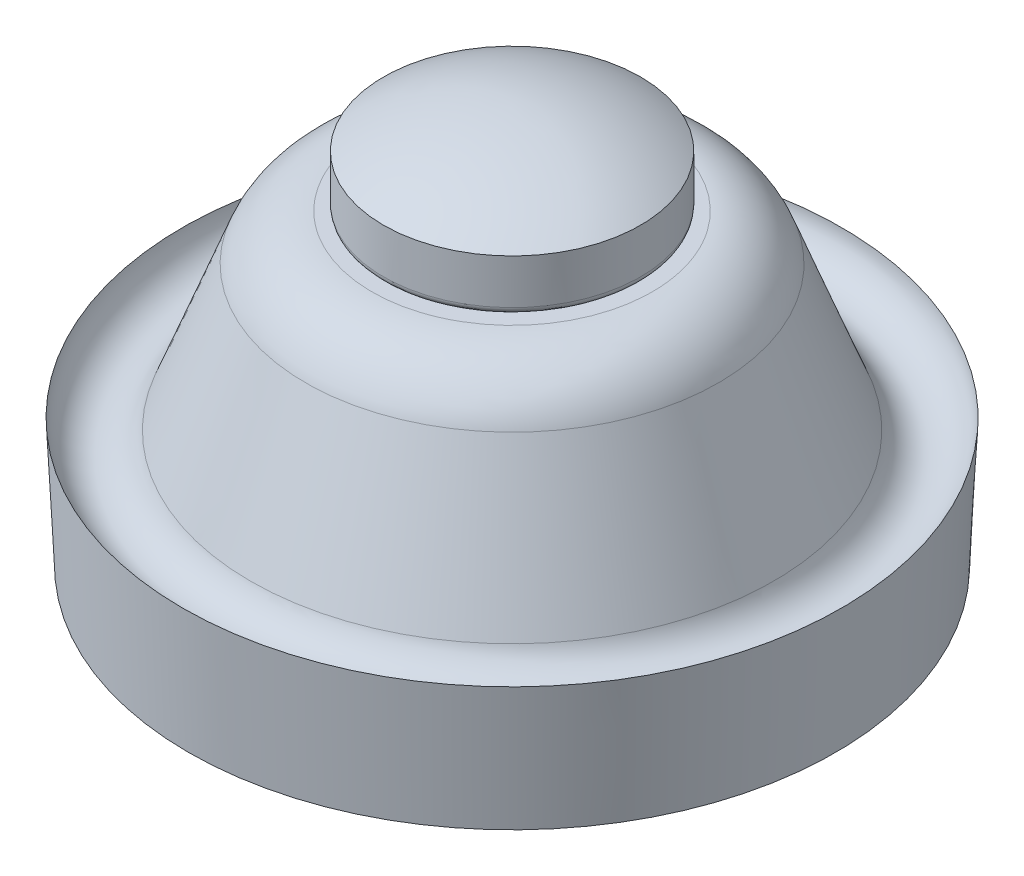
ISO-10303-21;
HEADER;
FILE_DESCRIPTION(('STEP AP214'),'2;1');
FILE_NAME('part.step','',(''),(''),'','','');
FILE_SCHEMA(('AUTOMOTIVE_DESIGN { 1 0 10303 214 1 1 1 1 }'));
ENDSEC;
DATA;
#1=APPLICATION_CONTEXT('core data for automotive mechanical design processes');
#2=APPLICATION_PROTOCOL_DEFINITION('international standard','automotive_design',2000,#1);
#3=PRODUCT_CONTEXT('',#1,'mechanical');
#4=PRODUCT('Part','Part','',(#3));
#5=PRODUCT_RELATED_PRODUCT_CATEGORY('part','',(#4));
#6=PRODUCT_DEFINITION_FORMATION('','',#4);
#7=PRODUCT_DEFINITION_CONTEXT('part definition',#1,'design');
#8=PRODUCT_DEFINITION('design','',#6,#7);
#9=PRODUCT_DEFINITION_SHAPE('','',#8);
#10=(LENGTH_UNIT() NAMED_UNIT(*) SI_UNIT(.MILLI.,.METRE.));
#11=(NAMED_UNIT(*) PLANE_ANGLE_UNIT() SI_UNIT($,.RADIAN.));
#12=(NAMED_UNIT(*) SI_UNIT($,.STERADIAN.) SOLID_ANGLE_UNIT());
#13=UNCERTAINTY_MEASURE_WITH_UNIT(LENGTH_MEASURE(1.E-05),#10,'distance_accuracy_value','');
#14=(GEOMETRIC_REPRESENTATION_CONTEXT(3) GLOBAL_UNCERTAINTY_ASSIGNED_CONTEXT((#13)) GLOBAL_UNIT_ASSIGNED_CONTEXT((#10,
#11,#12)) REPRESENTATION_CONTEXT('',''));
#15=CARTESIAN_POINT('',(0.,0.,0.));
#16=DIRECTION('',(0.,0.,1.));
#17=DIRECTION('',(1.,0.,0.));
#18=AXIS2_PLACEMENT_3D('',#15,#16,#17);
#19=CARTESIAN_POINT('',(8.02520376779074,8.40673403467268,-1.33165124514094));
#20=CARTESIAN_POINT('',(8.30025990662801,8.78333287431659,-0.828164360217661));
#21=CARTESIAN_POINT('',(8.62927271393994,8.78331451773941,-0.225910456147021));
#22=CARTESIAN_POINT('',(8.90431553386389,8.40673288127268,0.277552048668911));
#23=CARTESIAN_POINT('',(7.30266902570184,8.78500075273985,-1.21986519684432));
#24=CARTESIAN_POINT('',(7.65221649956741,9.26359095477898,-0.580022837777804));
#25=CARTESIAN_POINT('',(8.07033331074442,9.26356762683141,0.185334851323273));
#26=CARTESIAN_POINT('',(8.41986385863794,8.78499928697343,0.8251462276058));
#27=CARTESIAN_POINT('',(6.58019622025074,8.78504618500183,-0.825210486870182));
#28=CARTESIAN_POINT('',(6.92975264100401,9.26364863685853,-0.185351750635584));
#29=CARTESIAN_POINT('',(7.34788015414408,9.26362530831387,0.580025528277484));
#30=CARTESIAN_POINT('',(7.69741964849208,8.78504471919788,1.21985328093507));
#31=CARTESIAN_POINT('',(6.09568604510346,8.40673460978903,-0.27755133921551));
#32=CARTESIAN_POINT('',(6.3707422971973,8.78333360450052,0.225935753022496));
#33=CARTESIAN_POINT('',(6.69975523998287,8.78331524791578,0.828189905075975));
#34=CARTESIAN_POINT('',(6.97479817315788,8.40673345638857,1.3316526171966));
#35=(BOUNDED_SURFACE() B_SPLINE_SURFACE(3,3,((#19,#20,#21,#22),(#23,#24,#25,#26),(#27,#28,#29,
#30),(#31,#32,#33,#34)),.UNSPECIFIED.,.F.,.F.,.F.) B_SPLINE_SURFACE_WITH_KNOTS((4,4),(4,4),
(0.0040176299229081,0.995021458452253),(0.00437590383398458,0.996008558787676),
.UNSPECIFIED.) GEOMETRIC_REPRESENTATION_ITEM() RATIONAL_B_SPLINE_SURFACE(((0.997211143563106,
0.888207505122892,0.888249782954952,0.997337977059287),(0.887683865167595,0.790652487497458,
0.790690121803508,0.887796768085747),(0.887577766603012,0.790557986406136,0.790595616214024,
0.887690656026678),(0.996892847869358,0.887924001848925,0.887966266186499,0.997019640882079))) REPRESENTATION_ITEM('') SURFACE());
#36=CARTESIAN_POINT('',(7.5,8.68849448912,0.));
#37=DIRECTION('',(0.,-1.,0.));
#38=DIRECTION('',(0.,0.,-1.));
#39=AXIS2_PLACEMENT_3D('',#36,#37,#38);
#40=CIRCLE('',#39,1.0875);
#41=CARTESIAN_POINT('',(7.5,8.68849448912,-1.0875));
#42=VERTEX_POINT('',#41);
#43=EDGE_CURVE('E22',#42,#42,#40,.T.);
#44=ORIENTED_EDGE('',*,*,#43,.F.);
#45=EDGE_LOOP('',(#44));
#46=FACE_BOUND('',#45,.T.);
#47=ADVANCED_FACE('F18',(#46),#35,.T.);
#48=CARTESIAN_POINT('',(7.5,7.33,0.));
#49=DIRECTION('',(0.,-1.,0.));
#50=DIRECTION('',(0.,0.,-1.));
#51=AXIS2_PLACEMENT_3D('',#48,#49,#50);
#52=CYLINDRICAL_SURFACE('',#51,1.0875);
#53=CARTESIAN_POINT('',(7.4999999999995,8.31,-9.15391894229511E-13));
#54=DIRECTION('',(0.,-1.,0.));
#55=DIRECTION('',(0.,0.,-1.));
#56=AXIS2_PLACEMENT_3D('',#53,#54,#55);
#57=CIRCLE('',#56,1.0875);
#58=CARTESIAN_POINT('',(7.4999999999995,8.31,-1.08750000000091));
#59=VERTEX_POINT('',#58);
#60=EDGE_CURVE('E49',#59,#59,#57,.T.);
#61=ORIENTED_EDGE('',*,*,#60,.F.);
#62=EDGE_LOOP('',(#61));
#63=FACE_BOUND('',#62,.T.);
#64=ORIENTED_EDGE('',*,*,#43,.T.);
#65=EDGE_LOOP('',(#64));
#66=FACE_BOUND('',#65,.T.);
#67=ADVANCED_FACE('F73',(#63,#66),#52,.T.);
#68=CARTESIAN_POINT('',(7.4999999999995,8.31,-9.15391894229511E-13));
#69=DIRECTION('',(0.,1.,0.));
#70=DIRECTION('',(0.,0.,1.));
#71=AXIS2_PLACEMENT_3D('',#68,#69,#70);
#72=TOROIDAL_SURFACE('',#71,1.0275,0.0600000000000022);
#73=CARTESIAN_POINT('',(6.59828391765885,8.25,0.492609740915141));
#74=CARTESIAN_POINT('',(6.50442286896452,8.25,0.31998469948159));
#75=CARTESIAN_POINT('',(6.48026789624973,8.25,0.126105854656517));
#76=CARTESIAN_POINT('',(6.45408007694605,8.25,-0.0840895454805245));
#77=CARTESIAN_POINT('',(6.51406275519078,8.25,-0.289281868248178));
#78=CARTESIAN_POINT('',(6.57347365265042,8.25,-0.49251820920843));
#79=CARTESIAN_POINT('',(6.71006030646931,8.25,-0.657078024731101));
#80=CARTESIAN_POINT('',(6.83455921385319,8.25,-0.807074504321501));
#81=CARTESIAN_POINT('',(7.00739025908305,8.25,-0.901716082341741));
#82=CARTESIAN_POINT('',(7.17843681640505,8.25,-0.995380482035404));
#83=CARTESIAN_POINT('',(7.37389414534275,8.25,-1.0197321037513));
#84=CARTESIAN_POINT('',(7.58408957421035,8.25,-1.04591991465619));
#85=CARTESIAN_POINT('',(7.78928186824737,8.25,-0.98593724480946));
#86=CARTESIAN_POINT('',(7.99251781849009,8.25,-0.926526461565344));
#87=CARTESIAN_POINT('',(8.15707802472992,8.25,-0.789939693530232));
#88=CARTESIAN_POINT('',(8.30666688900967,8.25,-0.665779302796178));
#89=CARTESIAN_POINT('',(8.4017160823409,8.25,-0.492609740915607));
#90=B_SPLINE_CURVE_WITH_KNOTS('',2,(#73,#74,#75,#76,#77,#78,#79,#80,#81,#82,#83,#84,#85,#86,#87,
#88,#89),.UNSPECIFIED.,.F.,.F.,(3,2,2,2,2,2,2,2,3),(0.,0.125,0.25,0.375,0.5,0.625,0.75,0.875,
1.),.UNSPECIFIED.);
#91=CARTESIAN_POINT('',(6.59828391765778,8.25,0.492609740914615));
#92=VERTEX_POINT('',#91);
#93=CARTESIAN_POINT('',(8.40171608234163,8.25,-0.492609740915712));
#94=VERTEX_POINT('',#93);
#95=EDGE_CURVE('E45',#92,#94,#90,.T.);
#96=ORIENTED_EDGE('',*,*,#95,.F.);
#97=CARTESIAN_POINT('',(8.4017160823409,8.25,-0.492609740915607));
#98=CARTESIAN_POINT('',(8.49557713103572,8.25,-0.319984699481131));
#99=CARTESIAN_POINT('',(8.51973210375027,8.25,-0.126105854656513));
#100=CARTESIAN_POINT('',(8.54591992305404,8.25,0.0840895454828091));
#101=CARTESIAN_POINT('',(8.48593724480922,8.25,0.289281868248183));
#102=CARTESIAN_POINT('',(8.426526347348,8.25,0.492518209211252));
#103=CARTESIAN_POINT('',(8.28993969353069,8.25,0.657078024731108));
#104=CARTESIAN_POINT('',(8.16544078614522,8.25,0.807074504322582));
#105=CARTESIAN_POINT('',(7.99260974091694,8.25,0.901716082341744));
#106=CARTESIAN_POINT('',(7.82156318359417,8.25,0.995380482035626));
#107=CARTESIAN_POINT('',(7.62610585465721,8.25,1.01973210375131));
#108=CARTESIAN_POINT('',(7.4159104257892,8.25,1.04591991465611));
#109=CARTESIAN_POINT('',(7.21071813175259,8.25,0.985937244809451));
#110=CARTESIAN_POINT('',(7.00748218150939,8.25,0.92652646156514));
#111=CARTESIAN_POINT('',(6.84292197527006,8.25,0.789939693530218));
#112=CARTESIAN_POINT('',(6.69333311099014,8.25,0.665779302795806));
#113=CARTESIAN_POINT('',(6.59828391765885,8.25,0.492609740915141));
#114=B_SPLINE_CURVE_WITH_KNOTS('',2,(#97,#98,#99,#100,#101,#102,#103,#104,#105,#106,#107,#108,
#109,#110,#111,#112,#113),.UNSPECIFIED.,.F.,.F.,(3,2,2,2,2,2,2,2,3),(0.,0.125,0.25,0.375,0.5,
0.625,0.75,0.875,1.),.UNSPECIFIED.);
#115=EDGE_CURVE('E43',#94,#92,#114,.T.);
#116=ORIENTED_EDGE('',*,*,#115,.F.);
#117=EDGE_LOOP('',(#96,#116));
#118=FACE_BOUND('',#117,.T.);
#119=ORIENTED_EDGE('',*,*,#60,.T.);
#120=EDGE_LOOP('',(#119));
#121=FACE_BOUND('',#120,.T.);
#122=ADVANCED_FACE('F51',(#118,#121),#72,.T.);
#123=CARTESIAN_POINT('',(8.5275,8.25,0.));
#124=DIRECTION('',(0.,1.,0.));
#125=DIRECTION('',(0.,0.,1.));
#126=AXIS2_PLACEMENT_3D('',#123,#124,#125);
#127=PLANE('',#126);
#128=ORIENTED_EDGE('',*,*,#95,.T.);
#129=ORIENTED_EDGE('',*,*,#115,.T.);
#130=EDGE_LOOP('',(#128,#129));
#131=FACE_BOUND('',#130,.T.);
#132=CARTESIAN_POINT('',(8.54119458655066,8.25,-0.568807195045247));
#133=CARTESIAN_POINT('',(8.54989533102568,8.24999999998539,-0.552847209157696));
#134=CARTESIAN_POINT('',(8.55822975290871,8.24999999933377,-0.536687553952732));
#135=CARTESIAN_POINT('',(8.57414937660378,8.24999999722215,-0.504004023643311));
#136=CARTESIAN_POINT('',(8.58173460497803,8.24999999576216,-0.487480161477016));
#137=CARTESIAN_POINT('',(8.59613967337149,8.24999999249936,-0.454102692246172));
#138=CARTESIAN_POINT('',(8.60295953600667,8.24999999069655,-0.437249094942327));
#139=CARTESIAN_POINT('',(8.61581972214001,8.24999998711034,-0.403247521586895));
#140=CARTESIAN_POINT('',(8.62186006406759,8.24999998532694,-0.386099552505699));
#141=CARTESIAN_POINT('',(8.63314856930675,8.24999998206608,-0.351545157316641));
#142=CARTESIAN_POINT('',(8.63839674666584,8.24999998058863,-0.334138735797946));
#143=CARTESIAN_POINT('',(8.64808996416501,8.24999997814314,-0.299103908880908));
#144=CARTESIAN_POINT('',(8.65253501380037,8.2499999771751,-0.281475506109655));
#145=CARTESIAN_POINT('',(8.66061268215373,8.24999997587081,-0.246033646907614));
#146=CARTESIAN_POINT('',(8.66424530567457,8.24999997553455,-0.228220191571458));
#147=CARTESIAN_POINT('',(8.67069052308611,8.24999997553456,-0.192445542992505));
#148=CARTESIAN_POINT('',(8.6735031169768,8.24999997587082,-0.174484349749707));
#149=CARTESIAN_POINT('',(8.67830238214781,8.2499999771751,-0.138451848382515));
#150=CARTESIAN_POINT('',(8.68028904854523,8.24999997814313,-0.120380539607757));
#151=CARTESIAN_POINT('',(8.68343229261696,8.24999998058865,-0.0841656585464842));
#152=CARTESIAN_POINT('',(8.6845888604762,8.24999998206614,-0.0660220854080679));
#153=CARTESIAN_POINT('',(8.68606944605356,8.24999998532688,-0.0297006820059778));
#154=CARTESIAN_POINT('',(8.68639344900565,8.24999998711013,-0.011522851140445));
#155=CARTESIAN_POINT('',(8.6862082674796,8.24999999069677,0.0248290042034154));
#156=CARTESIAN_POINT('',(8.68569906329901,8.24999999250015,0.0430030285815693));
#157=CARTESIAN_POINT('',(8.68384822930136,8.24999999576137,0.0793091574195491));
#158=CARTESIAN_POINT('',(8.68250657488001,8.24999999721921,0.0974412606244333));
#159=CARTESIAN_POINT('',(8.67899459121118,8.24999999933671,0.1336257301615));
#160=CARTESIAN_POINT('',(8.67682423257362,8.24999999999635,0.151678093642733));
#161=CARTESIAN_POINT('',(8.67165854813341,8.25000000000364,0.187644346150211));
#162=CARTESIAN_POINT('',(8.66866412134449,8.24999999935271,0.205558364333388));
#163=CARTESIAN_POINT('',(8.66162053765509,8.24999999737583,0.242444666685205));
#164=CARTESIAN_POINT('',(8.65751342687932,8.24999999600693,0.261405911184372));
#165=CARTESIAN_POINT('',(8.6480808109507,8.24999999297112,0.300305567378331));
#166=CARTESIAN_POINT('',(8.64269430903054,8.24999999129079,0.320229181274626));
#167=CARTESIAN_POINT('',(8.63053275505658,8.24999998795101,0.360954146496393));
#168=CARTESIAN_POINT('',(8.62369382268398,8.24999998629885,0.381736521126203));
#169=CARTESIAN_POINT('',(8.6124240396421,8.24999998405221,0.413036206452512));
#170=CARTESIAN_POINT('',(8.60840777097516,8.24999998333004,0.42370466352054));
#171=CARTESIAN_POINT('',(8.5999556936243,8.2499999819785,0.445209328105939));
#172=CARTESIAN_POINT('',(8.5955114593226,8.24999998135217,0.456042235091698));
#173=CARTESIAN_POINT('',(8.58618220724914,8.24999998021374,0.477855750167048));
#174=CARTESIAN_POINT('',(8.58128864810823,8.24999997970509,0.48883270305792));
#175=CARTESIAN_POINT('',(8.57103961211642,8.24999997881813,0.510913132232601));
#176=CARTESIAN_POINT('',(8.56567548992438,8.24999997844352,0.522012597077153));
#177=CARTESIAN_POINT('',(8.5544646296567,8.24999997783639,0.544314985007636));
#178=CARTESIAN_POINT('',(8.54860916106367,8.24999997760766,0.555513519964306));
#179=CARTESIAN_POINT('',(8.53639541515652,8.24999997729935,0.577989241124059));
#180=CARTESIAN_POINT('',(8.53002834079809,8.24999997722355,0.589261647631434));
#181=CARTESIAN_POINT('',(8.51677184777397,8.24999997722355,0.611858464116206));
#182=CARTESIAN_POINT('',(8.50987358603068,8.249999977303,0.623177687022121));
#183=CARTESIAN_POINT('',(8.49553597963343,8.2499999776113,0.645839625758951));
#184=CARTESIAN_POINT('',(8.48808776770613,8.24999997784358,0.657176732304862));
#185=CARTESIAN_POINT('',(8.47263247319736,8.24999997845069,0.679844031658414));
#186=CARTESIAN_POINT('',(8.46461652249646,8.24999997882865,0.691168178732153));
#187=CARTESIAN_POINT('',(8.44800907407644,8.24999997971561,0.713777237471937));
#188=CARTESIAN_POINT('',(8.43940873223197,8.24999998022734,0.725055653577821));
#189=CARTESIAN_POINT('',(8.42161710552526,8.24999998136568,0.74753900343606));
#190=CARTESIAN_POINT('',(8.41241702688317,8.24999998199455,0.758736979377376));
#191=CARTESIAN_POINT('',(8.3934119874294,8.24999998334634,0.781023277925125));
#192=CARTESIAN_POINT('',(8.38359831104344,8.24999998407097,0.792104169142013));
#193=CARTESIAN_POINT('',(8.36335377778321,8.24999998558876,0.814118216894426));
#194=CARTESIAN_POINT('',(8.35291431290659,8.24999998638304,0.825043458376514));
#195=CARTESIAN_POINT('',(8.33140773502588,8.24999998800992,0.846706240952682));
#196=CARTESIAN_POINT('',(8.32033215242826,8.24999998884298,0.857435374611654));
#197=CARTESIAN_POINT('',(8.29754490130021,8.24999999051257,0.878664136146576));
#198=CARTESIAN_POINT('',(8.28582493393004,8.24999999134883,0.889154857092638));
#199=CARTESIAN_POINT('',(8.26174269725077,8.24999999298515,0.909863192450503));
#200=CARTESIAN_POINT('',(8.24937233341765,8.24999999378417,0.920071394764801));
#201=CARTESIAN_POINT('',(8.2239855539156,8.24999999530217,0.940169419373116));
#202=CARTESIAN_POINT('',(8.21096128370653,8.2499999960193,0.95004932153859));
#203=CARTESIAN_POINT('',(8.18426547105896,8.2499999973229,0.969443703889638));
#204=CARTESIAN_POINT('',(8.17058634821881,8.24999999790664,0.97894775146925));
#205=CARTESIAN_POINT('',(8.14258291249718,8.24999999889611,0.997542444725838));
#206=CARTESIAN_POINT('',(8.12825133929311,8.24999999929833,1.00662215661358));
#207=CARTESIAN_POINT('',(8.09894644621894,8.24999999984214,1.02431662939495));
#208=CARTESIAN_POINT('',(8.08396619333928,8.24999999997885,1.03291991789575));
#209=CARTESIAN_POINT('',(8.05664727422228,8.25000000001697,1.04783218315938));
#210=CARTESIAN_POINT('',(8.04437233815799,8.24999999995958,1.05425832656249));
#211=CARTESIAN_POINT('',(8.01960935035133,8.24999999999854,1.06668640571256));
#212=CARTESIAN_POINT('',(8.00712129803748,8.2500000000949,1.07268834032175));
#213=CARTESIAN_POINT('',(7.98194591792893,8.24999999939453,1.08425935021762));
#214=CARTESIAN_POINT('',(7.96925858489742,8.24999999859777,1.08982841410615));
#215=CARTESIAN_POINT('',(7.94369931491162,8.24999999379799,1.10052776175205));
#216=CARTESIAN_POINT('',(7.9308273687659,8.24999998979481,1.10565802357338));
#217=CARTESIAN_POINT('',(7.90815351316179,8.24999997694226,1.11424639002425));
#218=CARTESIAN_POINT('',(7.89838837864335,8.24999996955421,1.11780194896265));
#219=CARTESIAN_POINT('',(7.87876903893451,8.24999994877696,1.12466070833882));
#220=CARTESIAN_POINT('',(7.8689148276895,8.24999993538734,1.12796389147597));
#221=CARTESIAN_POINT('',(7.84912349709576,8.24999990123586,1.13431465533797));
#222=CARTESIAN_POINT('',(7.83918637103278,8.24999988047338,1.13736221513781));
#223=CARTESIAN_POINT('',(7.81923692065694,8.24999982509993,1.14320349473936));
#224=CARTESIAN_POINT('',(7.80922458928515,8.24999979048763,1.14599719038221));
#225=CARTESIAN_POINT('',(7.78245727435141,8.24999969407014,1.15307931519855));
#226=CARTESIAN_POINT('',(7.76563829657562,8.24999962946565,1.15712894751477));
#227=CARTESIAN_POINT('',(7.73183057578487,8.24999954462923,1.1644479693154));
#228=CARTESIAN_POINT('',(7.71484182127441,8.24999952440033,1.16771730558827));
#229=CARTESIAN_POINT('',(7.68073301704722,8.24999953119083,1.17347443638023));
#230=CARTESIAN_POINT('',(7.66361297017684,8.24999955820921,1.17596224779349));
#231=CARTESIAN_POINT('',(7.62927786285529,8.2499996495854,1.18015146012635));
#232=CARTESIAN_POINT('',(7.61206281320153,8.24999971393904,1.18185294862456));
#233=CARTESIAN_POINT('',(7.58792232409661,8.24999980622343,1.18367649783806));
#234=CARTESIAN_POINT('',(7.58102076303732,8.2499998328397,1.18413366925686));
#235=CARTESIAN_POINT('',(7.56721107840135,8.24999988370955,1.18492804733108));
#236=CARTESIAN_POINT('',(7.56030295550927,8.24999990796333,1.18526526536203));
#237=CARTESIAN_POINT('',(7.53957323446726,8.24999996963083,1.18604762831512));
#238=CARTESIAN_POINT('',(7.52574334315563,8.24999999596572,1.18626372348983));
#239=CARTESIAN_POINT('',(7.50794316587797,8.25000000115866,1.18640706187771));
#240=CARTESIAN_POINT('',(7.50397166275209,8.25000000047783,1.18643040437064));
#241=CARTESIAN_POINT('',(7.48254050698006,8.24999999788104,1.18644379322445));
#242=CARTESIAN_POINT('',(7.46507792919031,8.24999999962245,1.18605155817478));
#243=CARTESIAN_POINT('',(7.43925923119569,8.25000000017779,1.1849101428312));
#244=CARTESIAN_POINT('',(7.43088837100287,8.25000000004298,1.18445252770486));
#245=CARTESIAN_POINT('',(7.41438919597876,8.24999999993968,1.1833743148677));
#246=CARTESIAN_POINT('',(7.40626056757132,8.24999999996671,1.18275856757341));
#247=CARTESIAN_POINT('',(7.37977173886803,8.2500000000096,1.18047733297485));
#248=CARTESIAN_POINT('',(7.36143994455589,8.24999999996838,1.17846747712681));
#249=CARTESIAN_POINT('',(7.32618609287823,8.24999999992263,1.17376813284956));
#250=CARTESIAN_POINT('',(7.30925619064395,8.24999999991571,1.17113689705639));
#251=CARTESIAN_POINT('',(7.276812485384,8.24999999989369,1.16537229299814));
#252=CARTESIAN_POINT('',(7.26128915987786,8.24999999987926,1.16229252876872));
#253=CARTESIAN_POINT('',(7.23165458470225,8.24999999985603,1.15579428077032));
#254=CARTESIAN_POINT('',(7.21753257634532,8.24999999984685,1.1524247633427));
#255=CARTESIAN_POINT('',(7.19068685927514,8.24999999983306,1.14549607411819));
#256=CARTESIAN_POINT('',(7.17795169912173,8.24999999982811,1.14198126935958));
#257=CARTESIAN_POINT('',(7.15385990098288,8.24999999982383,1.13489692185615));
#258=CARTESIAN_POINT('',(7.14249150628802,8.249999999824,1.1313671808531));
#259=CARTESIAN_POINT('',(7.1122789892955,8.249999999834,1.12148517654187));
#260=CARTESIAN_POINT('',(7.09353364553665,8.24999999985023,1.1148273675724));
#261=CARTESIAN_POINT('',(7.06128267861682,8.24999999989375,1.10245037248919));
#262=CARTESIAN_POINT('',(7.04769471874716,8.24999999991702,1.09694435037239));
#263=CARTESIAN_POINT('',(7.02554074746125,8.24999999997756,1.08748266001364));
#264=CARTESIAN_POINT('',(7.0169115296567,8.25000000000689,1.08367416203101));
#265=CARTESIAN_POINT('',(6.98635316191838,8.24999999998236,1.06974716581008));
#266=CARTESIAN_POINT('',(6.96468143468549,8.24999999972727,1.0590555763621));
#267=CARTESIAN_POINT('',(6.92284344657328,8.24999999885106,1.03680559150251));
#268=CARTESIAN_POINT('',(6.90265128180125,8.24999999824424,1.02529568909131));
#269=CARTESIAN_POINT('',(6.86376183901441,8.24999999687992,1.00158912071197));
#270=CARTESIAN_POINT('',(6.84503702505658,8.24999999612934,0.989437654166123));
#271=CARTESIAN_POINT('',(6.80905865609188,8.2499999946317,0.964621436231549));
#272=CARTESIAN_POINT('',(6.79177626931291,8.24999999388577,0.951998455360091));
#273=CARTESIAN_POINT('',(6.75864596999305,8.24999999252363,0.926399602797194));
#274=CARTESIAN_POINT('',(6.74276832837405,8.24999999190322,0.913462194210005));
#275=CARTESIAN_POINT('',(6.71240031070136,8.24999999088179,0.887383020163241));
#276=CARTESIAN_POINT('',(6.69787965552294,8.24999999047216,0.874276498567988));
#277=CARTESIAN_POINT('',(6.67016983200131,8.24999998992743,0.847995339589501));
#278=CARTESIAN_POINT('',(6.6569501597967,8.24999998978031,0.834852851774322));
#279=CARTESIAN_POINT('',(6.63177985124988,8.24999998978042,0.808623948053895));
#280=CARTESIAN_POINT('',(6.61979878212703,8.24999998991349,0.795566725057184));
#281=CARTESIAN_POINT('',(6.59703825663613,8.24999999045849,0.76962076803047));
#282=CARTESIAN_POINT('',(6.58622870753062,8.2499999908556,0.756758421642458));
#283=CARTESIAN_POINT('',(6.56574038334732,8.24999999187723,0.731303310022633));
#284=CARTESIAN_POINT('',(6.55603209821871,8.24999999248811,0.718734287176655));
#285=CARTESIAN_POINT('',(6.53767345471192,8.24999999385079,0.693956128873079));
#286=CARTESIAN_POINT('',(6.52899438634894,8.24999999459237,0.681768256295415));
#287=CARTESIAN_POINT('',(6.5126205577348,8.24999999608974,0.657832547807429));
#288=CARTESIAN_POINT('',(6.50489808237288,8.24999999684185,0.646103663009795));
#289=CARTESIAN_POINT('',(6.49036421707935,8.24999999820854,0.623156569767449));
#290=CARTESIAN_POINT('',(6.48352627634772,8.24999999882891,0.611955169864323));
#291=CARTESIAN_POINT('',(6.47068943677121,8.24999999970079,0.590124978594014));
#292=CARTESIAN_POINT('',(6.46466531352681,8.24999999997508,0.579511013545942));
#293=CARTESIAN_POINT('',(6.45880541344981,8.25,0.568807195046104));
#294=B_SPLINE_CURVE_WITH_KNOTS('',3,(#132,#133,#134,#135,#136,#137,#138,#139,#140,#141,#142,
#143,#144,#145,#146,#147,#148,#149,#150,#151,#152,#153,#154,#155,#156,#157,#158,#159,#160,#161,
#162,#163,#164,#165,#166,#167,#168,#169,#170,#171,#172,#173,#174,#175,#176,#177,#178,#179,#180,
#181,#182,#183,#184,#185,#186,#187,#188,#189,#190,#191,#192,#193,#194,#195,#196,#197,#198,#199,
#200,#201,#202,#203,#204,#205,#206,#207,#208,#209,#210,#211,#212,#213,#214,#215,#216,#217,#218,
#219,#220,#221,#222,#223,#224,#225,#226,#227,#228,#229,#230,#231,#232,#233,#234,#235,#236,#237,
#238,#239,#240,#241,#242,#243,#244,#245,#246,#247,#248,#249,#250,#251,#252,#253,#254,#255,#256,
#257,#258,#259,#260,#261,#262,#263,#264,#265,#266,#267,#268,#269,#270,#271,#272,#273,#274,#275,
#276,#277,#278,#279,#280,#281,#282,#283,#284,#285,#286,#287,#288,#289,#290,#291,#292,#293),
.UNSPECIFIED.,.F.,.F.,(4,2,2,2,2,2,2,2,2,2,2,2,2,2,2,2,2,2,2,2,2,2,2,2,2,2,2,2,2,2,2,2,2,2,2,2,
2,2,2,2,2,2,2,2,2,2,2,2,2,2,2,2,2,2,2,2,2,2,2,2,2,2,2,2,2,2,2,2,2,2,2,2,2,2,2,2,2,2,2,2,4),(0.,
0.0545279008955622,0.109053867842689,0.16357822316584,0.218101289189628,0.272623388238792,
0.327144842638158,0.381665974712608,0.436187106787057,0.490708561186419,0.545230660235576,
0.599753726259356,0.654278081582496,0.70880404852961,0.763331949425157,0.817800597552283,
0.875979717509587,0.937869069676862,1.00346834184202,1.03766264168824,1.07278456827983,
1.10883407828687,1.14581112427469,1.18371565470465,1.22254761393485,1.26230694222075,
1.30299357571578,1.34460744647179,1.38714848243955,1.43061660746917,1.47501174131047,
1.52033379961336,1.56658269392813,1.6137583317058,1.66186061629836,1.71088944695905,
1.76084471884264,1.81172632300558,1.86353414640633,1.9050922374055,1.94665043986376,
1.98820973624381,2.02977110899123,2.06094476333499,2.09212055274956,2.12329889168988,
2.1544801946025,2.20635983839657,2.25824301906187,2.31012507809526,2.36200135724599,
2.38275073501316,2.40349814452998,2.44498412074705,2.45689903939949,2.50927721247972,
2.53442604403832,2.55888029970124,2.61418307289596,2.66556697090752,2.71303180785086,
2.75657741509915,2.79620364128508,2.83191035230236,2.89156007596851,2.93553338102516,
2.96382837634359,3.03627447070261,3.10596262368515,3.17289312237057,3.23706622608483,
3.29848216640247,3.35714114714965,3.41304334440863,3.46618890652407,3.51657795411161,
3.56421058006958,3.60908684959498,3.65120680020515,3.69057044176768,3.72717775654215),.UNSPECIFIED.);
#295=CARTESIAN_POINT('',(8.54119454643033,8.25,-0.568807268328496));
#296=VERTEX_POINT('',#295);
#297=CARTESIAN_POINT('',(6.45880545356301,8.25,0.568807268317257));
#298=VERTEX_POINT('',#297);
#299=EDGE_CURVE('E53',#296,#298,#294,.T.);
#300=ORIENTED_EDGE('',*,*,#299,.F.);
#301=CARTESIAN_POINT('',(6.45880541344981,8.25,0.568807195046104));
#302=CARTESIAN_POINT('',(6.45010466897476,8.24999999998539,0.552847209158568));
#303=CARTESIAN_POINT('',(6.44177024709172,8.24999999933377,0.536687553953618));
#304=CARTESIAN_POINT('',(6.42585062339661,8.24999999722215,0.504004023644221));
#305=CARTESIAN_POINT('',(6.41826539502233,8.24999999576217,0.487480161477937));
#306=CARTESIAN_POINT('',(6.40386032662883,8.24999999249936,0.454102692247113));
#307=CARTESIAN_POINT('',(6.39704046399363,8.24999999069655,0.437249094943278));
#308=CARTESIAN_POINT('',(6.38418027786025,8.24999998711034,0.403247521587862));
#309=CARTESIAN_POINT('',(6.37813993593265,8.24999998532694,0.386099552506674));
#310=CARTESIAN_POINT('',(6.36685143069344,8.24999998206608,0.351545157317629));
#311=CARTESIAN_POINT('',(6.36160325333433,8.24999998058863,0.334138735798939));
#312=CARTESIAN_POINT('',(6.35191003583511,8.24999997814314,0.299103908881909));
#313=CARTESIAN_POINT('',(6.34746498619973,8.2499999771751,0.28147550611066));
#314=CARTESIAN_POINT('',(6.33938731784633,8.24999997587081,0.246033646908623));
#315=CARTESIAN_POINT('',(6.33575469432546,8.24999997553455,0.228220191572468));
#316=CARTESIAN_POINT('',(6.32930947691388,8.24999997553456,0.192445542993516));
#317=CARTESIAN_POINT('',(6.32649688302316,8.24999997587082,0.174484349750718));
#318=CARTESIAN_POINT('',(6.32169761785211,8.2499999771751,0.138451848383522));
#319=CARTESIAN_POINT('',(6.31971095145467,8.24999997814313,0.120380539608762));
#320=CARTESIAN_POINT('',(6.3165677073829,8.24999998058865,0.0841656585474823));
#321=CARTESIAN_POINT('',(6.31541113952364,8.24999998206614,0.0660220854090616));
#322=CARTESIAN_POINT('',(6.31393055394625,8.24999998532688,0.0297006820069614));
#323=CARTESIAN_POINT('',(6.31360655099413,8.24999998711013,0.011522851141423));
#324=CARTESIAN_POINT('',(6.31379173252014,8.24999999069677,-0.0248290042024508));
#325=CARTESIAN_POINT('',(6.31430093670071,8.24999999250015,-0.0430030285806124));
#326=CARTESIAN_POINT('',(6.31615177069833,8.24999999576138,-0.079309157418609));
#327=CARTESIAN_POINT('',(6.31749342511965,8.24999999721921,-0.0974412606235023));
#328=CARTESIAN_POINT('',(6.32100540878845,8.24999999933672,-0.133625730160588));
#329=CARTESIAN_POINT('',(6.32317576742599,8.24999999999635,-0.151678093641832));
#330=CARTESIAN_POINT('',(6.32834145186663,8.25000000000364,-0.18764434615256));
#331=CARTESIAN_POINT('',(6.33133587865616,8.24999999935271,-0.205558364338957));
#332=CARTESIAN_POINT('',(6.33837946234695,8.24999999737583,-0.24244466669666));
#333=CARTESIAN_POINT('',(6.34248657312351,8.24999999600693,-0.261405911198494));
#334=CARTESIAN_POINT('',(6.35191918905389,8.24999999297112,-0.300305567397222));
#335=CARTESIAN_POINT('',(6.35730569097498,8.24999999129079,-0.320229181295622));
#336=CARTESIAN_POINT('',(6.36946724495092,8.24999998795101,-0.360954146521024));
#337=CARTESIAN_POINT('',(6.37630617732454,8.24999998629885,-0.381736521152369));
#338=CARTESIAN_POINT('',(6.38757596036803,8.24999998405221,-0.413036206480729));
#339=CARTESIAN_POINT('',(6.39159222903548,8.24999998333004,-0.423704663549311));
#340=CARTESIAN_POINT('',(6.40004430638739,8.2499999819785,-0.445209328135675));
#341=CARTESIAN_POINT('',(6.40448854068959,8.24999998135217,-0.456042235121846));
#342=CARTESIAN_POINT('',(6.41381779276406,8.24999998021374,-0.477855750197881));
#343=CARTESIAN_POINT('',(6.41871135190546,8.24999997970509,-0.488832703089026));
#344=CARTESIAN_POINT('',(6.42896038789824,8.24999997881813,-0.510913132264115));
#345=CARTESIAN_POINT('',(6.43432451009076,8.24999997844352,-0.522012597108803));
#346=CARTESIAN_POINT('',(6.44553537035934,8.24999997783639,-0.544314985039423));
#347=CARTESIAN_POINT('',(6.4513908389528,8.24999997760766,-0.555513519996095));
#348=CARTESIAN_POINT('',(6.46360458486077,8.24999997729935,-0.577989241155725));
#349=CARTESIAN_POINT('',(6.46997165921957,8.24999997722355,-0.589261647662977));
#350=CARTESIAN_POINT('',(6.4832281522444,8.24999997722355,-0.61185846414736));
#351=CARTESIAN_POINT('',(6.49012641398802,8.249999977303,-0.623177687053011));
#352=CARTESIAN_POINT('',(6.50446402038582,8.2499999776113,-0.645839625789255));
#353=CARTESIAN_POINT('',(6.51191223231334,8.24999997784358,-0.657176732334847));
#354=CARTESIAN_POINT('',(6.52736752682261,8.24999997845069,-0.679844031687411));
#355=CARTESIAN_POINT('',(6.53538347752377,8.24999997882865,-0.691168178760477));
#356=CARTESIAN_POINT('',(6.55199092594373,8.24999997971561,-0.713777237499728));
#357=CARTESIAN_POINT('',(6.56059126778786,8.24999998022734,-0.725055653605774));
#358=CARTESIAN_POINT('',(6.57838289449574,8.24999998136568,-0.747539003460705));
#359=CARTESIAN_POINT('',(6.58758297313938,8.24999998199455,-0.758736979398476));
#360=CARTESIAN_POINT('',(6.60658801258857,8.24999998334634,-0.781023277952684));
#361=CARTESIAN_POINT('',(6.61640168896823,8.24999998407097,-0.792104169179872));
#362=CARTESIAN_POINT('',(6.63664622224492,8.24999998558876,-0.814118216900295));
#363=CARTESIAN_POINT('',(6.64708568714493,8.24999998638304,-0.825043458338995));
#364=CARTESIAN_POINT('',(6.66859226495983,8.24999998800993,-0.846706241030473));
#365=CARTESIAN_POINT('',(6.67966784746594,8.24999998884298,-0.857435374852296));
#366=CARTESIAN_POINT('',(6.7024550988434,8.24999999051256,-0.878664135935267));
#367=CARTESIAN_POINT('',(6.71417506656319,8.24999999134881,-0.889154856250884));
#368=CARTESIAN_POINT('',(6.7382573022785,8.24999999298517,-0.909863193337348));
#369=CARTESIAN_POINT('',(6.75062766476526,8.24999999378424,-0.920071398069661));
#370=CARTESIAN_POINT('',(6.77601444796424,8.2499999953021,-0.940169416027405));
#371=CARTESIAN_POINT('',(6.78903872334018,8.24999999601904,-0.950049308902146));
#372=CARTESIAN_POINT('',(6.81573452178348,8.24999999732316,-0.96944371678187));
#373=CARTESIAN_POINT('',(6.82941362478695,8.24999999790764,-0.978947800017711));
#374=CARTESIAN_POINT('',(6.85741711501343,8.24999999889509,-0.997542395288416));
#375=CARTESIAN_POINT('',(6.87174876431219,8.2499999992945,-1.00662197038245));
#376=CARTESIAN_POINT('',(6.90105344829804,8.24999999984604,-1.02431681902187));
#377=CARTESIAN_POINT('',(6.91603340939298,8.24999999999356,-1.03292063204189));
#378=CARTESIAN_POINT('',(6.9433226328562,8.25000000000516,-1.04781501174143));
#379=CARTESIAN_POINT('',(6.95556734259591,8.24999999992,-1.05422424700428));
#380=CARTESIAN_POINT('',(6.98027073398495,8.24999999987343,-1.0666163649425));
#381=CARTESIAN_POINT('',(6.99272941461441,8.24999999991202,-1.07259924964934));
#382=CARTESIAN_POINT('',(7.01784630807542,8.25000000000461,-1.08413059910633));
#383=CARTESIAN_POINT('',(7.03050452253737,8.25000000005862,-1.08967906030457));
#384=CARTESIAN_POINT('',(7.05600544174646,8.24999999969406,-1.1003352654406));
#385=CARTESIAN_POINT('',(7.06884815038355,8.2499999992755,-1.10544300006994));
#386=CARTESIAN_POINT('',(7.0947028972712,8.24999999710064,-1.11521161321833));
#387=CARTESIAN_POINT('',(7.10771494127339,8.24999999534431,-1.11987247651376));
#388=CARTESIAN_POINT('',(7.13389299453197,8.24999998920883,-1.12874186075941));
#389=CARTESIAN_POINT('',(7.14705901099497,8.24999998482955,-1.13295036044231));
#390=CARTESIAN_POINT('',(7.17352940009876,8.24999997191177,-1.14090985987583));
#391=CARTESIAN_POINT('',(7.18683378098391,8.24999996337301,-1.14466083219352));
#392=CARTESIAN_POINT('',(7.21356539821265,8.24999993971688,-1.15170128741146));
#393=CARTESIAN_POINT('',(7.22699264343733,8.24999992459903,-1.1549907366659));
#394=CARTESIAN_POINT('',(7.24817589843338,8.24999989493188,-1.15979266629581));
#395=CARTESIAN_POINT('',(7.25589654087486,8.24999988291496,-1.16146257947624));
#396=CARTESIAN_POINT('',(7.27136920709886,8.24999985362123,-1.16465174505081));
#397=CARTESIAN_POINT('',(7.27912123253043,8.24999983634414,-1.16617098941805));
#398=CARTESIAN_POINT('',(7.30637798206315,8.24999978163169,-1.17121906294476));
#399=CARTESIAN_POINT('',(7.32596415149035,8.24999975312263,-1.1743206062293));
#400=CARTESIAN_POINT('',(7.36527360079145,8.24999976487259,-1.1794598610859));
#401=CARTESIAN_POINT('',(7.38499687374265,8.24999980512817,-1.18149762598103));
#402=CARTESIAN_POINT('',(7.41661512831781,8.24999988717897,-1.18393723658973));
#403=CARTESIAN_POINT('',(7.42848536240875,8.249999921916,-1.18466740783329));
#404=CARTESIAN_POINT('',(7.45224192474807,8.24999997632255,-1.18569770365251));
#405=CARTESIAN_POINT('',(7.46412824974217,8.24999999599476,-1.18599790503715));
#406=CARTESIAN_POINT('',(7.48090503036285,8.25000000156692,-1.18628416719819));
#407=CARTESIAN_POINT('',(7.48579500185666,8.25000000053014,-1.18635112505438));
#408=CARTESIAN_POINT('',(7.5018610076882,8.24999999861045,-1.18647975631686));
#409=CARTESIAN_POINT('',(7.51303844668217,8.24999999963797,-1.1864240275083));
#410=CARTESIAN_POINT('',(7.54167236255445,8.24999999938462,-1.18587901608738));
#411=CARTESIAN_POINT('',(7.55912466050248,8.24999999648044,-1.18516352031928));
#412=CARTESIAN_POINT('',(7.60025840372079,8.24999998391066,-1.18257281073352));
#413=CARTESIAN_POINT('',(7.62392055718526,8.24999997218735,-1.18037283002363));
#414=CARTESIAN_POINT('',(7.65745391587558,8.2499999487837,-1.17623426427676));
#415=CARTESIAN_POINT('',(7.66740017735603,8.24999994098608,-1.17487805002928));
#416=CARTESIAN_POINT('',(7.68725502520317,8.24999992562614,-1.17191046194932));
#417=CARTESIAN_POINT('',(7.69716361004641,8.24999991806382,-1.17029907790915));
#418=CARTESIAN_POINT('',(7.73011825360941,8.24999989381887,-1.16450513948498));
#419=CARTESIAN_POINT('',(7.7530678971551,8.24999987841811,-1.15975875299006));
#420=CARTESIAN_POINT('',(7.79864142975849,8.24999985643576,-1.14890197905125));
#421=CARTESIAN_POINT('',(7.82126530556673,8.24999984985453,-1.14279153629496));
#422=CARTESIAN_POINT('',(7.86610769475414,8.24999984741472,-1.12922858532579));
#423=CARTESIAN_POINT('',(7.88832620667497,8.24999985155618,-1.1217760722857));
#424=CARTESIAN_POINT('',(7.9322768525658,8.24999986938678,-1.1055555711895));
#425=CARTESIAN_POINT('',(7.95400900273744,8.2499998830756,-1.09678762702811));
#426=CARTESIAN_POINT('',(7.99690873245541,8.2499999152608,-1.07796953288694));
#427=CARTESIAN_POINT('',(8.01807635159623,8.24999993375684,-1.06791947311833));
#428=CARTESIAN_POINT('',(8.05976969453245,8.24999996849727,-1.046568143345));
#429=CARTESIAN_POINT('',(8.08029548695273,8.24999998474191,-1.0352670076975));
#430=CARTESIAN_POINT('',(8.11049038468766,8.24999999698808,-1.01745806129423));
#431=CARTESIAN_POINT('',(8.12042684586229,8.249999999062,-1.01139873052081));
#432=CARTESIAN_POINT('',(8.14106959127351,8.25000000053181,-0.998399480834096));
#433=CARTESIAN_POINT('',(8.15175790935502,8.2499999996507,-0.991430941739255));
#434=CARTESIAN_POINT('',(8.17383534438829,8.24999999667517,-0.976529800662944));
#435=CARTESIAN_POINT('',(8.18520359040109,8.24999999448101,-0.968566274758046));
#436=CARTESIAN_POINT('',(8.2085629978515,8.24999998969859,-0.951590585721763));
#437=CARTESIAN_POINT('',(8.22053036912532,8.2499999870928,-0.942545664608931));
#438=CARTESIAN_POINT('',(8.24499731149515,8.24999998223541,-0.923319691443401));
#439=CARTESIAN_POINT('',(8.25746986606782,8.2499999800248,-0.91310424065686));
#440=CARTESIAN_POINT('',(8.2828434693213,8.2499999764427,-0.891449273647406));
#441=CARTESIAN_POINT('',(8.29571404206668,8.24999997514022,-0.879974029667124));
#442=CARTESIAN_POINT('',(8.32176572007914,8.24999997364335,-0.855712554088473));
#443=CARTESIAN_POINT('',(8.33491263489457,8.24999997352649,-0.842889590788922));
#444=CARTESIAN_POINT('',(8.36138396564971,8.24999997443195,-0.815848843511137));
#445=CARTESIAN_POINT('',(8.37467023368963,8.24999997552423,-0.801593696368769));
#446=CARTESIAN_POINT('',(8.40127136431898,8.24999997864203,-0.771610035909263));
#447=CARTESIAN_POINT('',(8.41454388771997,8.24999998071763,-0.755843941295531));
#448=CARTESIAN_POINT('',(8.44095226399762,8.24999998535517,-0.72276768343366));
#449=CARTESIAN_POINT('',(8.45404137662648,8.24999998793743,-0.705420183352735));
#450=CARTESIAN_POINT('',(8.47990064738086,8.24999999289705,-0.669120788485321));
#451=CARTESIAN_POINT('',(8.4926194630864,8.24999999525695,-0.650132299462999));
#452=CARTESIAN_POINT('',(8.51754014678323,8.24999999884116,-0.610504843776595));
#453=CARTESIAN_POINT('',(8.52968597226375,8.25000000000402,-0.589830616024211));
#454=CARTESIAN_POINT('',(8.54119458655066,8.25,-0.568807195045246));
#455=B_SPLINE_CURVE_WITH_KNOTS('',3,(#301,#302,#303,#304,#305,#306,#307,#308,#309,#310,#311,
#312,#313,#314,#315,#316,#317,#318,#319,#320,#321,#322,#323,#324,#325,#326,#327,#328,#329,#330,
#331,#332,#333,#334,#335,#336,#337,#338,#339,#340,#341,#342,#343,#344,#345,#346,#347,#348,#349,
#350,#351,#352,#353,#354,#355,#356,#357,#358,#359,#360,#361,#362,#363,#364,#365,#366,#367,#368,
#369,#370,#371,#372,#373,#374,#375,#376,#377,#378,#379,#380,#381,#382,#383,#384,#385,#386,#387,
#388,#389,#390,#391,#392,#393,#394,#395,#396,#397,#398,#399,#400,#401,#402,#403,#404,#405,#406,
#407,#408,#409,#410,#411,#412,#413,#414,#415,#416,#417,#418,#419,#420,#421,#422,#423,#424,#425,
#426,#427,#428,#429,#430,#431,#432,#433,#434,#435,#436,#437,#438,#439,#440,#441,#442,#443,#444,
#445,#446,#447,#448,#449,#450,#451,#452,#453,#454),.UNSPECIFIED.,.F.,.F.,(4,2,2,2,2,2,2,2,2,2,2,
2,2,2,2,2,2,2,2,2,2,2,2,2,2,2,2,2,2,2,2,2,2,2,2,2,2,2,2,2,2,2,2,2,2,2,2,2,2,2,2,2,2,2,2,2,2,2,2,
2,2,2,2,2,2,2,2,2,2,2,2,2,2,2,2,2,4),(0.,0.0545279008955541,0.109053867842679,0.163578223165828,
0.218101289189617,0.272623388238785,0.327144842638157,0.381665974712617,0.436187106787078,
0.490708561186454,0.545230660235628,0.599753726259427,0.654278081582587,0.708804048529725,
0.763331949425296,0.817800597562233,0.875979717527851,0.937869069701947,1.00346834187243,
1.03766264172075,1.07278456831407,1.10883407832246,1.14581112431126,1.18371565474182,
1.22254761397225,1.26230694225801,1.30299357575253,1.34460744650764,1.38714848247414,
1.43061660750212,1.47501174134141,1.52033379964191,1.56658269395392,1.61375833172845,
1.6618606163175,1.71088944697432,1.76084471885364,1.81172632301196,1.8635341464077,
1.90498830460213,1.94644226526297,1.98789656482314,2.02935173971246,2.07080832635726,
2.11226686117985,2.15372788059814,2.19519192102513,2.21888801612228,2.24258537295515,
2.30204486434375,2.3615013749732,2.39717273600207,2.43283772397275,2.44750909698724,
2.48103725450788,2.53342247690863,2.60466610678136,2.63477843487413,2.66489196787104,
2.73515185706929,2.80541459581954,2.87567758729813,2.94593823468632,3.01619394117626,
3.08644210997702,3.1213529568601,3.15962426680092,3.20125601075539,3.246248255592,
3.2946011646094,3.34631499788362,3.40139011250736,3.45982696275817,3.52162610021862,
3.58678817386306,3.65531393012068,3.72720421292112),.UNSPECIFIED.);
#456=EDGE_CURVE('E35',#298,#296,#455,.T.);
#457=ORIENTED_EDGE('',*,*,#456,.F.);
#458=EDGE_LOOP('',(#300,#457));
#459=FACE_BOUND('',#458,.T.);
#460=ADVANCED_FACE('F46',(#131,#459),#127,.T.);
#461=CARTESIAN_POINT('',(7.50000000000039,7.65,7.15248173188687E-13));
#462=DIRECTION('',(0.,1.,0.));
#463=DIRECTION('',(0.,0.,1.));
#464=AXIS2_PLACEMENT_3D('',#461,#462,#463);
#465=TOROIDAL_SURFACE('',#464,1.18643490854,0.599999999999997);
#466=ORIENTED_EDGE('',*,*,#299,.T.);
#467=ORIENTED_EDGE('',*,*,#456,.T.);
#468=EDGE_LOOP('',(#466,#467));
#469=FACE_BOUND('',#468,.T.);
#470=CARTESIAN_POINT('',(7.5,7.86350403916458,0.));
#471=DIRECTION('',(0.,-1.,0.));
#472=DIRECTION('',(0.,0.,-1.));
#473=AXIS2_PLACEMENT_3D('',#470,#471,#472);
#474=CIRCLE('',#473,1.7471630291368);
#475=CARTESIAN_POINT('',(7.5,7.86350403916458,-1.7471630291368));
#476=VERTEX_POINT('',#475);
#477=EDGE_CURVE('E100',#476,#476,#474,.T.);
#478=ORIENTED_EDGE('',*,*,#477,.F.);
#479=EDGE_LOOP('',(#478));
#480=FACE_BOUND('',#479,.T.);
#481=ADVANCED_FACE('F70',(#469,#480),#465,.T.);
#482=CARTESIAN_POINT('',(7.5,6.64208646719544,0.));
#483=DIRECTION('',(0.,-1.,0.));
#484=DIRECTION('',(0.,0.,-1.));
#485=AXIS2_PLACEMENT_3D('',#482,#483,#484);
#486=CONICAL_SURFACE('',#485,2.21223259774206,0.363812814837575);
#487=CARTESIAN_POINT('',(7.5,6.64208646718807,0.));
#488=DIRECTION('',(0.,1.,0.));
#489=DIRECTION('',(0.,0.,1.));
#490=AXIS2_PLACEMENT_3D('',#487,#488,#489);
#491=CIRCLE('',#490,2.21223259775474);
#492=CARTESIAN_POINT('',(7.5,6.64208646718807,2.21223259775474));
#493=VERTEX_POINT('',#492);
#494=EDGE_CURVE('E107',#493,#493,#491,.T.);
#495=ORIENTED_EDGE('',*,*,#494,.T.);
#496=EDGE_LOOP('',(#495));
#497=FACE_BOUND('',#496,.T.);
#498=ORIENTED_EDGE('',*,*,#477,.T.);
#499=EDGE_LOOP('',(#498));
#500=FACE_BOUND('',#499,.T.);
#501=ADVANCED_FACE('F71',(#497,#500),#486,.T.);
#502=CARTESIAN_POINT('',(7.5,6.74819685585,0.));
#503=DIRECTION('',(0.,1.,0.));
#504=DIRECTION('',(0.,0.,1.));
#505=AXIS2_PLACEMENT_3D('',#502,#503,#504);
#506=TOROIDAL_SURFACE('',#505,2.49091153534999,0.298196855854);
#507=ORIENTED_EDGE('',*,*,#494,.F.);
#508=EDGE_LOOP('',(#507));
#509=FACE_BOUND('',#508,.T.);
#510=CARTESIAN_POINT('',(7.5,6.73410869956115,0.));
#511=DIRECTION('',(0.,1.,0.));
#512=DIRECTION('',(0.,0.,1.));
#513=AXIS2_PLACEMENT_3D('',#510,#511,#512);
#514=CIRCLE('',#513,2.78877541146727);
#515=CARTESIAN_POINT('',(7.5,6.73410869956115,2.78877541146727));
#516=VERTEX_POINT('',#515);
#517=EDGE_CURVE('E28',#516,#516,#514,.F.);
#518=ORIENTED_EDGE('',*,*,#517,.F.);
#519=EDGE_LOOP('',(#518));
#520=FACE_BOUND('',#519,.T.);
#521=ADVANCED_FACE('F20',(#509,#520),#506,.F.);
#522=CARTESIAN_POINT('',(7.5,6.73410869956115,0.));
#523=DIRECTION('',(0.,1.,0.));
#524=DIRECTION('',(0.,0.,1.));
#525=AXIS2_PLACEMENT_3D('',#522,#523,#524);
#526=CONICAL_SURFACE('',#525,2.78877541146727,0.0472620760003387);
#527=ORIENTED_EDGE('',*,*,#517,.T.);
#528=EDGE_LOOP('',(#527));
#529=FACE_BOUND('',#528,.T.);
#530=CARTESIAN_POINT('',(7.5,5.65000000000282,0.));
#531=DIRECTION('',(0.,1.,0.));
#532=DIRECTION('',(0.,0.,1.));
#533=AXIS2_PLACEMENT_3D('',#530,#531,#532);
#534=CIRCLE('',#533,2.73750000000206);
#535=CARTESIAN_POINT('',(7.5,5.65000000000282,2.73750000000206));
#536=VERTEX_POINT('',#535);
#537=EDGE_CURVE('E11',#536,#536,#534,.T.);
#538=ORIENTED_EDGE('',*,*,#537,.T.);
#539=EDGE_LOOP('',(#538));
#540=FACE_BOUND('',#539,.T.);
#541=ADVANCED_FACE('F116',(#529,#540),#526,.T.);
#542=CARTESIAN_POINT('',(10.2375,5.65,0.));
#543=DIRECTION('',(0.,1.,0.));
#544=DIRECTION('',(0.,0.,1.));
#545=AXIS2_PLACEMENT_3D('',#542,#543,#544);
#546=PLANE('',#545);
#547=ORIENTED_EDGE('',*,*,#537,.F.);
#548=EDGE_LOOP('',(#547));
#549=FACE_BOUND('',#548,.T.);
#550=ADVANCED_FACE('F126',(#549),#546,.F.);
#551=CLOSED_SHELL('',(#47,#67,#122,#460,#481,#501,#521,#541,#550));
#552=MANIFOLD_SOLID_BREP('B1',#551);
#553=ADVANCED_BREP_SHAPE_REPRESENTATION('',(#18,#552),#14);
#554=SHAPE_DEFINITION_REPRESENTATION(#9,#553);
ENDSEC;
END-ISO-10303-21;
